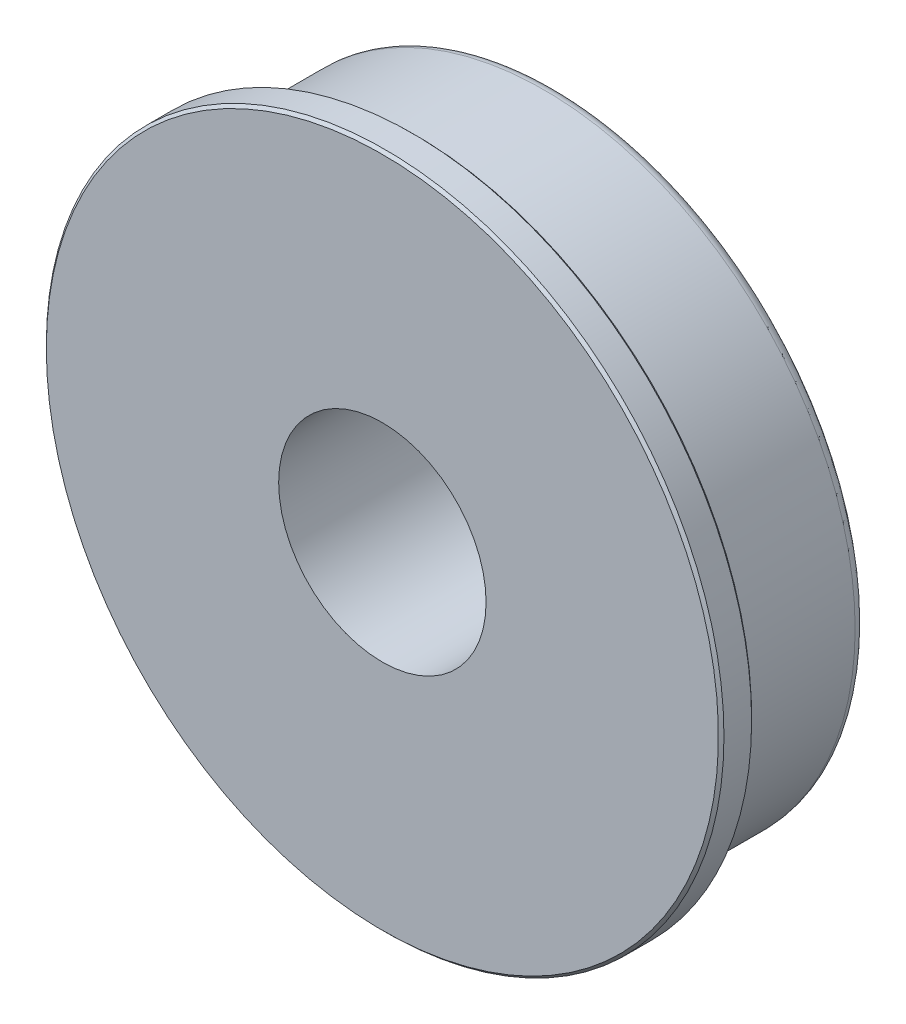
ISO-10303-21;
HEADER;
FILE_DESCRIPTION(('STEP AP214'),'2;1');
FILE_NAME('part.step','',(''),(''),'','','');
FILE_SCHEMA(('AUTOMOTIVE_DESIGN { 1 0 10303 214 1 1 1 1 }'));
ENDSEC;
DATA;
#1=APPLICATION_CONTEXT('core data for automotive mechanical design processes');
#2=APPLICATION_PROTOCOL_DEFINITION('international standard','automotive_design',2000,#1);
#3=PRODUCT_CONTEXT('',#1,'mechanical');
#4=PRODUCT('Part','Part','',(#3));
#5=PRODUCT_RELATED_PRODUCT_CATEGORY('part','',(#4));
#6=PRODUCT_DEFINITION_FORMATION('','',#4);
#7=PRODUCT_DEFINITION_CONTEXT('part definition',#1,'design');
#8=PRODUCT_DEFINITION('design','',#6,#7);
#9=PRODUCT_DEFINITION_SHAPE('','',#8);
#10=(LENGTH_UNIT() NAMED_UNIT(*) SI_UNIT(.MILLI.,.METRE.));
#11=(NAMED_UNIT(*) PLANE_ANGLE_UNIT() SI_UNIT($,.RADIAN.));
#12=(NAMED_UNIT(*) SI_UNIT($,.STERADIAN.) SOLID_ANGLE_UNIT());
#13=UNCERTAINTY_MEASURE_WITH_UNIT(LENGTH_MEASURE(1.E-05),#10,'distance_accuracy_value','');
#14=(GEOMETRIC_REPRESENTATION_CONTEXT(3) GLOBAL_UNCERTAINTY_ASSIGNED_CONTEXT((#13)) GLOBAL_UNIT_ASSIGNED_CONTEXT((#10,
#11,#12)) REPRESENTATION_CONTEXT('',''));
#15=CARTESIAN_POINT('',(0.,0.,0.));
#16=DIRECTION('',(0.,0.,1.));
#17=DIRECTION('',(1.,0.,0.));
#18=AXIS2_PLACEMENT_3D('',#15,#16,#17);
#19=CARTESIAN_POINT('',(0.,0.,-57.007125));
#20=DIRECTION('',(0.,0.,-1.));
#21=DIRECTION('',(-1.,0.,0.));
#22=AXIS2_PLACEMENT_3D('',#19,#20,#21);
#23=CYLINDRICAL_SURFACE('',#22,13.97);
#24=CARTESIAN_POINT('',(0.,0.,5.89534));
#25=DIRECTION('',(0.,0.,-1.));
#26=DIRECTION('',(-1.,0.,0.));
#27=AXIS2_PLACEMENT_3D('',#24,#25,#26);
#28=CIRCLE('',#27,13.97);
#29=CARTESIAN_POINT('',(-13.97,0.,5.89534));
#30=VERTEX_POINT('',#29);
#31=EDGE_CURVE('E19',#30,#30,#28,.F.);
#32=ORIENTED_EDGE('',*,*,#31,.T.);
#33=EDGE_LOOP('',(#32));
#34=FACE_BOUND('',#33,.T.);
#35=CARTESIAN_POINT('',(0.,0.,6.40333999999999));
#36=DIRECTION('',(0.,0.,-1.));
#37=DIRECTION('',(-1.,0.,0.));
#38=AXIS2_PLACEMENT_3D('',#35,#36,#37);
#39=CIRCLE('',#38,13.97);
#40=CARTESIAN_POINT('',(-13.97,0.,6.40333999999999));
#41=VERTEX_POINT('',#40);
#42=EDGE_CURVE('E46',#41,#41,#39,.F.);
#43=ORIENTED_EDGE('',*,*,#42,.F.);
#44=EDGE_LOOP('',(#43));
#45=FACE_BOUND('',#44,.T.);
#46=ADVANCED_FACE('F15',(#34,#45),#23,.T.);
#47=CARTESIAN_POINT('',(0.,47.3069264516129,5.89534));
#48=DIRECTION('',(0.,0.,-1.));
#49=DIRECTION('',(-1.,0.,0.));
#50=AXIS2_PLACEMENT_3D('',#47,#48,#49);
#51=PLANE('',#50);
#52=CARTESIAN_POINT('',(0.,0.,5.89534));
#53=DIRECTION('',(0.,0.,1.));
#54=DIRECTION('',(1.,0.,0.));
#55=AXIS2_PLACEMENT_3D('',#52,#53,#54);
#56=CIRCLE('',#55,14.2875);
#57=CARTESIAN_POINT('',(14.2875,0.,5.89534));
#58=VERTEX_POINT('',#57);
#59=EDGE_CURVE('E44',#58,#58,#56,.F.);
#60=ORIENTED_EDGE('',*,*,#59,.F.);
#61=EDGE_LOOP('',(#60));
#62=FACE_BOUND('',#61,.T.);
#63=ORIENTED_EDGE('',*,*,#31,.F.);
#64=EDGE_LOOP('',(#63));
#65=FACE_BOUND('',#64,.T.);
#66=ADVANCED_FACE('F55',(#62,#65),#51,.F.);
#67=CARTESIAN_POINT('',(0.,0.,6.40334));
#68=DIRECTION('',(0.,0.,-1.));
#69=DIRECTION('',(-1.,0.,0.));
#70=AXIS2_PLACEMENT_3D('',#67,#68,#69);
#71=PLANE('',#70);
#72=CARTESIAN_POINT('',(0.,0.,6.40334000000001));
#73=DIRECTION('',(0.,0.,1.));
#74=DIRECTION('',(0.,-1.,0.));
#75=AXIS2_PLACEMENT_3D('',#72,#73,#74);
#76=CIRCLE('',#75,15.4305);
#77=CARTESIAN_POINT('',(0.,-15.4305,6.40334000000001));
#78=VERTEX_POINT('',#77);
#79=EDGE_CURVE('E41',#78,#78,#76,.T.);
#80=ORIENTED_EDGE('',*,*,#79,.F.);
#81=EDGE_LOOP('',(#80));
#82=FACE_BOUND('',#81,.T.);
#83=ORIENTED_EDGE('',*,*,#42,.T.);
#84=EDGE_LOOP('',(#83));
#85=FACE_BOUND('',#84,.T.);
#86=ADVANCED_FACE('F57',(#82,#85),#71,.T.);
#87=CARTESIAN_POINT('',(0.,0.,6.40334));
#88=DIRECTION('',(0.,0.,1.));
#89=DIRECTION('',(1.,0.,0.));
#90=AXIS2_PLACEMENT_3D('',#87,#88,#89);
#91=CYLINDRICAL_SURFACE('',#90,14.2875);
#92=CARTESIAN_POINT('',(0.,0.,0.508));
#93=DIRECTION('',(0.,0.,-1.));
#94=DIRECTION('',(-1.,0.,0.));
#95=AXIS2_PLACEMENT_3D('',#92,#93,#94);
#96=CIRCLE('',#95,14.2875);
#97=CARTESIAN_POINT('',(-14.2875,0.,0.508));
#98=VERTEX_POINT('',#97);
#99=EDGE_CURVE('E31',#98,#98,#96,.T.);
#100=ORIENTED_EDGE('',*,*,#99,.F.);
#101=EDGE_LOOP('',(#100));
#102=FACE_BOUND('',#101,.T.);
#103=ORIENTED_EDGE('',*,*,#59,.T.);
#104=EDGE_LOOP('',(#103));
#105=FACE_BOUND('',#104,.T.);
#106=ADVANCED_FACE('F65',(#102,#105),#91,.T.);
#107=CARTESIAN_POINT('',(0.,0.,6.53034));
#108=DIRECTION('',(0.,0.,1.));
#109=DIRECTION('',(0.,-1.,0.));
#110=AXIS2_PLACEMENT_3D('',#107,#108,#109);
#111=CONICAL_SURFACE('',#110,15.5575000000007,0.785398163400003);
#112=CARTESIAN_POINT('',(0.,0.,6.53034));
#113=DIRECTION('',(0.,0.,1.));
#114=DIRECTION('',(1.,0.,0.));
#115=AXIS2_PLACEMENT_3D('',#112,#113,#114);
#116=CIRCLE('',#115,15.5575);
#117=CARTESIAN_POINT('',(15.5575,0.,6.53034));
#118=VERTEX_POINT('',#117);
#119=EDGE_CURVE('E40',#118,#118,#116,.T.);
#120=ORIENTED_EDGE('',*,*,#119,.F.);
#121=EDGE_LOOP('',(#120));
#122=FACE_BOUND('',#121,.T.);
#123=ORIENTED_EDGE('',*,*,#79,.T.);
#124=EDGE_LOOP('',(#123));
#125=FACE_BOUND('',#124,.T.);
#126=ADVANCED_FACE('F93',(#122,#125),#111,.T.);
#127=CARTESIAN_POINT('',(0.,0.,0.508000000000006));
#128=DIRECTION('',(0.,0.,-1.));
#129=DIRECTION('',(-1.,0.,0.));
#130=AXIS2_PLACEMENT_3D('',#127,#128,#129);
#131=TOROIDAL_SURFACE('',#130,13.7795,0.508000000000003);
#132=ORIENTED_EDGE('',*,*,#99,.T.);
#133=EDGE_LOOP('',(#132));
#134=FACE_BOUND('',#133,.T.);
#135=CARTESIAN_POINT('',(0.,0.,0.));
#136=DIRECTION('',(0.,0.,-1.));
#137=DIRECTION('',(-1.,0.,0.));
#138=AXIS2_PLACEMENT_3D('',#135,#136,#137);
#139=CIRCLE('',#138,13.7795);
#140=CARTESIAN_POINT('',(-13.7795,0.,0.));
#141=VERTEX_POINT('',#140);
#142=EDGE_CURVE('E37',#141,#141,#139,.T.);
#143=ORIENTED_EDGE('',*,*,#142,.F.);
#144=EDGE_LOOP('',(#143));
#145=FACE_BOUND('',#144,.T.);
#146=ADVANCED_FACE('F17',(#134,#145),#131,.T.);
#147=CARTESIAN_POINT('',(0.,0.,7.92734));
#148=DIRECTION('',(0.,0.,1.));
#149=DIRECTION('',(1.,0.,0.));
#150=AXIS2_PLACEMENT_3D('',#147,#148,#149);
#151=CYLINDRICAL_SURFACE('',#150,15.5575);
#152=CARTESIAN_POINT('',(0.,0.,7.80033999999999));
#153=DIRECTION('',(0.,0.,-1.));
#154=DIRECTION('',(-1.,0.,0.));
#155=AXIS2_PLACEMENT_3D('',#152,#153,#154);
#156=CIRCLE('',#155,15.5575);
#157=CARTESIAN_POINT('',(-15.5575,0.,7.80033999999999));
#158=VERTEX_POINT('',#157);
#159=EDGE_CURVE('E36',#158,#158,#156,.F.);
#160=ORIENTED_EDGE('',*,*,#159,.F.);
#161=EDGE_LOOP('',(#160));
#162=FACE_BOUND('',#161,.T.);
#163=ORIENTED_EDGE('',*,*,#119,.T.);
#164=EDGE_LOOP('',(#163));
#165=FACE_BOUND('',#164,.T.);
#166=ADVANCED_FACE('F88',(#162,#165),#151,.T.);
#167=CARTESIAN_POINT('',(0.,0.,0.));
#168=DIRECTION('',(0.,0.,-1.));
#169=DIRECTION('',(-1.,0.,0.));
#170=AXIS2_PLACEMENT_3D('',#167,#168,#169);
#171=PLANE('',#170);
#172=CARTESIAN_POINT('',(0.,0.,0.));
#173=DIRECTION('',(0.,0.,1.));
#174=DIRECTION('',(1.,0.,0.));
#175=AXIS2_PLACEMENT_3D('',#172,#173,#174);
#176=CIRCLE('',#175,4.7625);
#177=CARTESIAN_POINT('',(4.7625,0.,0.));
#178=VERTEX_POINT('',#177);
#179=EDGE_CURVE('E28',#178,#178,#176,.T.);
#180=ORIENTED_EDGE('',*,*,#179,.T.);
#181=EDGE_LOOP('',(#180));
#182=FACE_BOUND('',#181,.T.);
#183=ORIENTED_EDGE('',*,*,#142,.T.);
#184=EDGE_LOOP('',(#183));
#185=FACE_BOUND('',#184,.T.);
#186=ADVANCED_FACE('F84',(#182,#185),#171,.T.);
#187=CARTESIAN_POINT('',(0.,0.,7.80033999999999));
#188=DIRECTION('',(0.,0.,-1.));
#189=DIRECTION('',(-1.,0.,0.));
#190=AXIS2_PLACEMENT_3D('',#187,#188,#189);
#191=CONICAL_SURFACE('',#190,15.5575,0.785398163400003);
#192=ORIENTED_EDGE('',*,*,#159,.T.);
#193=EDGE_LOOP('',(#192));
#194=FACE_BOUND('',#193,.T.);
#195=CARTESIAN_POINT('',(0.,0.,7.92733999999967));
#196=DIRECTION('',(0.,0.,-1.));
#197=DIRECTION('',(-1.,0.,0.));
#198=AXIS2_PLACEMENT_3D('',#195,#196,#197);
#199=CIRCLE('',#198,15.4304999999997);
#200=CARTESIAN_POINT('',(-15.4304999999997,0.,7.92733999999967));
#201=VERTEX_POINT('',#200);
#202=EDGE_CURVE('E23',#201,#201,#199,.T.);
#203=ORIENTED_EDGE('',*,*,#202,.T.);
#204=EDGE_LOOP('',(#203));
#205=FACE_BOUND('',#204,.T.);
#206=ADVANCED_FACE('F77',(#194,#205),#191,.T.);
#207=CARTESIAN_POINT('',(0.,0.,0.));
#208=DIRECTION('',(0.,0.,1.));
#209=DIRECTION('',(1.,0.,0.));
#210=AXIS2_PLACEMENT_3D('',#207,#208,#209);
#211=CYLINDRICAL_SURFACE('',#210,4.7625);
#212=ORIENTED_EDGE('',*,*,#179,.F.);
#213=EDGE_LOOP('',(#212));
#214=FACE_BOUND('',#213,.T.);
#215=CARTESIAN_POINT('',(0.,0.,7.92734));
#216=DIRECTION('',(0.,0.,1.));
#217=DIRECTION('',(1.,0.,0.));
#218=AXIS2_PLACEMENT_3D('',#215,#216,#217);
#219=CIRCLE('',#218,4.7625);
#220=CARTESIAN_POINT('',(4.7625,0.,7.92734));
#221=VERTEX_POINT('',#220);
#222=EDGE_CURVE('E9',#221,#221,#219,.T.);
#223=ORIENTED_EDGE('',*,*,#222,.T.);
#224=EDGE_LOOP('',(#223));
#225=FACE_BOUND('',#224,.T.);
#226=ADVANCED_FACE('F71',(#214,#225),#211,.F.);
#227=CARTESIAN_POINT('',(0.,0.,7.92734));
#228=DIRECTION('',(0.,0.,-1.));
#229=DIRECTION('',(-1.,0.,0.));
#230=AXIS2_PLACEMENT_3D('',#227,#228,#229);
#231=PLANE('',#230);
#232=ORIENTED_EDGE('',*,*,#222,.F.);
#233=EDGE_LOOP('',(#232));
#234=FACE_BOUND('',#233,.T.);
#235=ORIENTED_EDGE('',*,*,#202,.F.);
#236=EDGE_LOOP('',(#235));
#237=FACE_BOUND('',#236,.T.);
#238=ADVANCED_FACE('F69',(#234,#237),#231,.F.);
#239=CLOSED_SHELL('',(#46,#66,#86,#106,#126,#146,#166,#186,#206,#226,#238));
#240=MANIFOLD_SOLID_BREP('B1',#239);
#241=ADVANCED_BREP_SHAPE_REPRESENTATION('',(#18,#240),#14);
#242=SHAPE_DEFINITION_REPRESENTATION(#9,#241);
ENDSEC;
END-ISO-10303-21;
